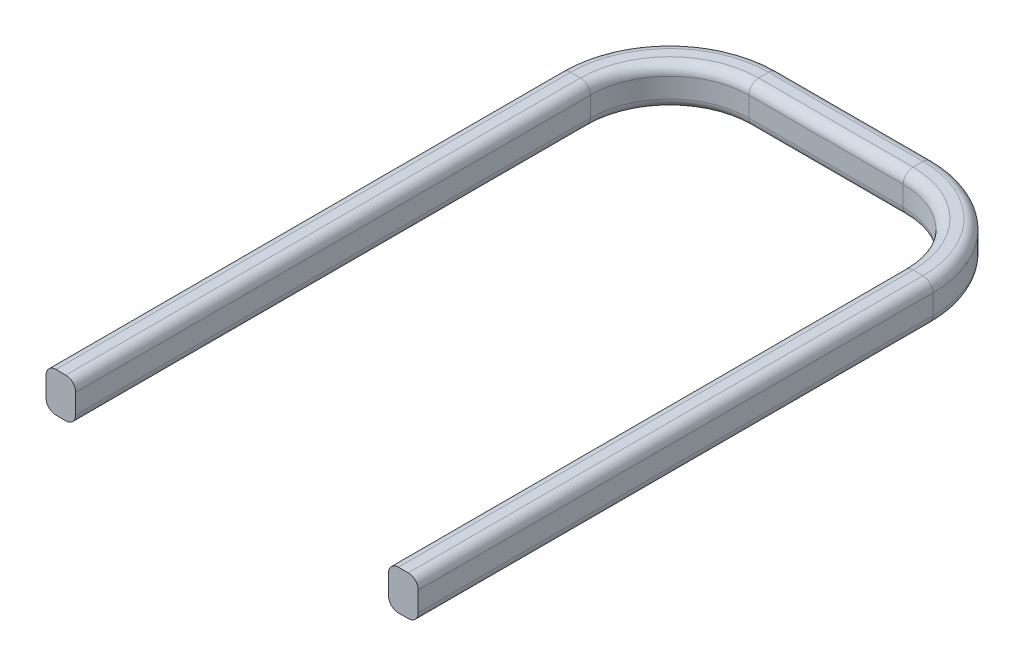
ISO-10303-21;
HEADER;
FILE_DESCRIPTION(('STEP AP214'),'2;1');
FILE_NAME('part.step','',(''),(''),'','','');
FILE_SCHEMA(('AUTOMOTIVE_DESIGN { 1 0 10303 214 1 1 1 1 }'));
ENDSEC;
DATA;
#1=APPLICATION_CONTEXT('core data for automotive mechanical design processes');
#2=APPLICATION_PROTOCOL_DEFINITION('international standard','automotive_design',2000,#1);
#3=PRODUCT_CONTEXT('',#1,'mechanical');
#4=PRODUCT('Part','Part','',(#3));
#5=PRODUCT_RELATED_PRODUCT_CATEGORY('part','',(#4));
#6=PRODUCT_DEFINITION_FORMATION('','',#4);
#7=PRODUCT_DEFINITION_CONTEXT('part definition',#1,'design');
#8=PRODUCT_DEFINITION('design','',#6,#7);
#9=PRODUCT_DEFINITION_SHAPE('','',#8);
#10=(LENGTH_UNIT() NAMED_UNIT(*) SI_UNIT(.MILLI.,.METRE.));
#11=(NAMED_UNIT(*) PLANE_ANGLE_UNIT() SI_UNIT($,.RADIAN.));
#12=(NAMED_UNIT(*) SI_UNIT($,.STERADIAN.) SOLID_ANGLE_UNIT());
#13=UNCERTAINTY_MEASURE_WITH_UNIT(LENGTH_MEASURE(1.E-05),#10,'distance_accuracy_value','');
#14=(GEOMETRIC_REPRESENTATION_CONTEXT(3) GLOBAL_UNCERTAINTY_ASSIGNED_CONTEXT((#13)) GLOBAL_UNIT_ASSIGNED_CONTEXT((#10,
#11,#12)) REPRESENTATION_CONTEXT('',''));
#15=CARTESIAN_POINT('',(0.,0.,0.));
#16=DIRECTION('',(0.,0.,1.));
#17=DIRECTION('',(1.,0.,0.));
#18=AXIS2_PLACEMENT_3D('',#15,#16,#17);
#19=CARTESIAN_POINT('',(0.,0.,0.));
#20=DIRECTION('',(0.,0.,1.));
#21=DIRECTION('',(1.,0.,0.));
#22=AXIS2_PLACEMENT_3D('',#19,#20,#21);
#23=PLANE('',#22);
#24=DIRECTION('',(0.,-1.,0.));
#25=VECTOR('',#24,1.);
#26=CARTESIAN_POINT('',(-4.7,0.,0.));
#27=LINE('',#26,#25);
#28=CARTESIAN_POINT('',(-4.7,0.75,0.));
#29=VERTEX_POINT('',#28);
#30=CARTESIAN_POINT('',(-4.7,0.25,0.));
#31=VERTEX_POINT('',#30);
#32=EDGE_CURVE('E457',#29,#31,#27,.T.);
#33=ORIENTED_EDGE('',*,*,#32,.T.);
#34=CARTESIAN_POINT('',(-4.45,0.25,0.));
#35=DIRECTION('',(0.,0.,1.));
#36=DIRECTION('',(1.,0.,0.));
#37=AXIS2_PLACEMENT_3D('',#34,#35,#36);
#38=CIRCLE('',#37,0.25);
#39=CARTESIAN_POINT('',(-4.45,0.,0.));
#40=VERTEX_POINT('',#39);
#41=EDGE_CURVE('E355',#31,#40,#38,.T.);
#42=ORIENTED_EDGE('',*,*,#41,.T.);
#43=DIRECTION('',(1.,0.,0.));
#44=VECTOR('',#43,1.);
#45=CARTESIAN_POINT('',(-3.95,0.,0.));
#46=LINE('',#45,#44);
#47=CARTESIAN_POINT('',(-4.2,0.,0.));
#48=VERTEX_POINT('',#47);
#49=EDGE_CURVE('E232',#40,#48,#46,.T.);
#50=ORIENTED_EDGE('',*,*,#49,.T.);
#51=CARTESIAN_POINT('',(-4.2,0.25,0.));
#52=DIRECTION('',(0.,0.,1.));
#53=DIRECTION('',(1.,0.,0.));
#54=AXIS2_PLACEMENT_3D('',#51,#52,#53);
#55=CIRCLE('',#54,0.25);
#56=CARTESIAN_POINT('',(-3.95,0.25,0.));
#57=VERTEX_POINT('',#56);
#58=EDGE_CURVE('E352',#48,#57,#55,.T.);
#59=ORIENTED_EDGE('',*,*,#58,.T.);
#60=DIRECTION('',(0.,1.,0.));
#61=VECTOR('',#60,1.);
#62=CARTESIAN_POINT('',(-3.95,0.,0.));
#63=LINE('',#62,#61);
#64=CARTESIAN_POINT('',(-3.95,0.75,0.));
#65=VERTEX_POINT('',#64);
#66=EDGE_CURVE('E213',#57,#65,#63,.T.);
#67=ORIENTED_EDGE('',*,*,#66,.T.);
#68=CARTESIAN_POINT('',(-4.2,0.75,0.));
#69=DIRECTION('',(0.,0.,1.));
#70=DIRECTION('',(1.,0.,0.));
#71=AXIS2_PLACEMENT_3D('',#68,#69,#70);
#72=CIRCLE('',#71,0.25);
#73=CARTESIAN_POINT('',(-4.2,1.,0.));
#74=VERTEX_POINT('',#73);
#75=EDGE_CURVE('E346',#65,#74,#72,.T.);
#76=ORIENTED_EDGE('',*,*,#75,.T.);
#77=DIRECTION('',(-1.,0.,0.));
#78=VECTOR('',#77,1.);
#79=CARTESIAN_POINT('',(-3.95,1.,0.));
#80=LINE('',#79,#78);
#81=CARTESIAN_POINT('',(-4.45,1.,0.));
#82=VERTEX_POINT('',#81);
#83=EDGE_CURVE('E454',#74,#82,#80,.T.);
#84=ORIENTED_EDGE('',*,*,#83,.T.);
#85=CARTESIAN_POINT('',(-4.45,0.75,0.));
#86=DIRECTION('',(0.,0.,1.));
#87=DIRECTION('',(1.,0.,0.));
#88=AXIS2_PLACEMENT_3D('',#85,#86,#87);
#89=CIRCLE('',#88,0.25);
#90=EDGE_CURVE('E349',#82,#29,#89,.T.);
#91=ORIENTED_EDGE('',*,*,#90,.T.);
#92=EDGE_LOOP('',(#33,#42,#50,#59,#67,#76,#84,#91));
#93=FACE_BOUND('',#92,.T.);
#94=ADVANCED_FACE('F42',(#93),#23,.T.);
#95=CARTESIAN_POINT('',(0.,0.,0.));
#96=DIRECTION('',(0.,0.,-1.));
#97=DIRECTION('',(-1.,0.,0.));
#98=AXIS2_PLACEMENT_3D('',#95,#96,#97);
#99=PLANE('',#98);
#100=DIRECTION('',(0.,1.,0.));
#101=VECTOR('',#100,1.);
#102=CARTESIAN_POINT('',(3.95,0.,0.));
#103=LINE('',#102,#101);
#104=CARTESIAN_POINT('',(3.95,0.25,0.));
#105=VERTEX_POINT('',#104);
#106=CARTESIAN_POINT('',(3.95,0.75,0.));
#107=VERTEX_POINT('',#106);
#108=EDGE_CURVE('E477',#105,#107,#103,.T.);
#109=ORIENTED_EDGE('',*,*,#108,.F.);
#110=CARTESIAN_POINT('',(4.2,0.25,0.));
#111=DIRECTION('',(0.,0.,-1.));
#112=DIRECTION('',(-1.,0.,0.));
#113=AXIS2_PLACEMENT_3D('',#110,#111,#112);
#114=CIRCLE('',#113,0.25);
#115=CARTESIAN_POINT('',(4.2,0.,0.));
#116=VERTEX_POINT('',#115);
#117=EDGE_CURVE('E300',#105,#116,#114,.F.);
#118=ORIENTED_EDGE('',*,*,#117,.T.);
#119=DIRECTION('',(-1.,0.,0.));
#120=VECTOR('',#119,1.);
#121=CARTESIAN_POINT('',(3.95,0.,0.));
#122=LINE('',#121,#120);
#123=CARTESIAN_POINT('',(4.45,0.,0.));
#124=VERTEX_POINT('',#123);
#125=EDGE_CURVE('E255',#124,#116,#122,.T.);
#126=ORIENTED_EDGE('',*,*,#125,.F.);
#127=CARTESIAN_POINT('',(4.45,0.25,0.));
#128=DIRECTION('',(0.,0.,-1.));
#129=DIRECTION('',(-1.,0.,0.));
#130=AXIS2_PLACEMENT_3D('',#127,#128,#129);
#131=CIRCLE('',#130,0.25);
#132=CARTESIAN_POINT('',(4.7,0.25,0.));
#133=VERTEX_POINT('',#132);
#134=EDGE_CURVE('E297',#124,#133,#131,.F.);
#135=ORIENTED_EDGE('',*,*,#134,.T.);
#136=DIRECTION('',(0.,-1.,0.));
#137=VECTOR('',#136,1.);
#138=CARTESIAN_POINT('',(4.7,0.,0.));
#139=LINE('',#138,#137);
#140=CARTESIAN_POINT('',(4.7,0.75,0.));
#141=VERTEX_POINT('',#140);
#142=EDGE_CURVE('E500',#141,#133,#139,.T.);
#143=ORIENTED_EDGE('',*,*,#142,.F.);
#144=CARTESIAN_POINT('',(4.45,0.75,0.));
#145=DIRECTION('',(0.,0.,-1.));
#146=DIRECTION('',(-1.,0.,0.));
#147=AXIS2_PLACEMENT_3D('',#144,#145,#146);
#148=CIRCLE('',#147,0.25);
#149=CARTESIAN_POINT('',(4.45,1.,0.));
#150=VERTEX_POINT('',#149);
#151=EDGE_CURVE('E294',#141,#150,#148,.F.);
#152=ORIENTED_EDGE('',*,*,#151,.T.);
#153=DIRECTION('',(1.,0.,0.));
#154=VECTOR('',#153,1.);
#155=CARTESIAN_POINT('',(3.95,1.,0.));
#156=LINE('',#155,#154);
#157=CARTESIAN_POINT('',(4.2,1.,0.));
#158=VERTEX_POINT('',#157);
#159=EDGE_CURVE('E480',#158,#150,#156,.T.);
#160=ORIENTED_EDGE('',*,*,#159,.F.);
#161=CARTESIAN_POINT('',(4.2,0.75,0.));
#162=DIRECTION('',(0.,0.,-1.));
#163=DIRECTION('',(-1.,0.,0.));
#164=AXIS2_PLACEMENT_3D('',#161,#162,#163);
#165=CIRCLE('',#164,0.25);
#166=EDGE_CURVE('E291',#158,#107,#165,.F.);
#167=ORIENTED_EDGE('',*,*,#166,.T.);
#168=EDGE_LOOP('',(#109,#118,#126,#135,#143,#152,#160,#167));
#169=FACE_BOUND('',#168,.T.);
#170=ADVANCED_FACE('F573',(#169),#99,.F.);
#171=CARTESIAN_POINT('',(-3.95,0.,0.));
#172=DIRECTION('',(-1.,0.,0.));
#173=DIRECTION('',(0.,0.,1.));
#174=AXIS2_PLACEMENT_3D('',#171,#172,#173);
#175=PLANE('',#174);
#176=ORIENTED_EDGE('',*,*,#66,.F.);
#177=DIRECTION('',(0.,0.,-1.));
#178=VECTOR('',#177,1.);
#179=CARTESIAN_POINT('',(-3.95,0.25,0.));
#180=LINE('',#179,#178);
#181=CARTESIAN_POINT('',(-3.95,0.25,-13.));
#182=VERTEX_POINT('',#181);
#183=EDGE_CURVE('E207',#57,#182,#180,.T.);
#184=ORIENTED_EDGE('',*,*,#183,.T.);
#185=DIRECTION('',(0.,1.,0.));
#186=VECTOR('',#185,1.);
#187=CARTESIAN_POINT('',(-3.95,0.,-13.));
#188=LINE('',#187,#186);
#189=CARTESIAN_POINT('',(-3.95,0.75,-13.));
#190=VERTEX_POINT('',#189);
#191=EDGE_CURVE('E210',#182,#190,#188,.T.);
#192=ORIENTED_EDGE('',*,*,#191,.T.);
#193=DIRECTION('',(0.,0.,-1.));
#194=VECTOR('',#193,1.);
#195=CARTESIAN_POINT('',(-3.95,0.75,0.));
#196=LINE('',#195,#194);
#197=EDGE_CURVE('E219',#190,#65,#196,.F.);
#198=ORIENTED_EDGE('',*,*,#197,.T.);
#199=EDGE_LOOP('',(#176,#184,#192,#198));
#200=FACE_BOUND('',#199,.T.);
#201=ADVANCED_FACE('F209',(#200),#175,.F.);
#202=CARTESIAN_POINT('',(-3.95,1.,0.));
#203=DIRECTION('',(0.,-1.,0.));
#204=DIRECTION('',(1.,0.,0.));
#205=AXIS2_PLACEMENT_3D('',#202,#203,#204);
#206=PLANE('',#205);
#207=DIRECTION('',(-1.,0.,0.));
#208=VECTOR('',#207,1.);
#209=CARTESIAN_POINT('',(-3.95,1.,-13.));
#210=LINE('',#209,#208);
#211=CARTESIAN_POINT('',(-4.2,1.,-13.));
#212=VERTEX_POINT('',#211);
#213=CARTESIAN_POINT('',(-4.45,1.,-13.));
#214=VERTEX_POINT('',#213);
#215=EDGE_CURVE('E231',#212,#214,#210,.T.);
#216=ORIENTED_EDGE('',*,*,#215,.T.);
#217=DIRECTION('',(0.,0.,-1.));
#218=VECTOR('',#217,1.);
#219=CARTESIAN_POINT('',(-4.45,1.,0.));
#220=LINE('',#219,#218);
#221=EDGE_CURVE('E362',#214,#82,#220,.F.);
#222=ORIENTED_EDGE('',*,*,#221,.T.);
#223=ORIENTED_EDGE('',*,*,#83,.F.);
#224=DIRECTION('',(0.,0.,-1.));
#225=VECTOR('',#224,1.);
#226=CARTESIAN_POINT('',(-4.2,1.,0.));
#227=LINE('',#226,#225);
#228=EDGE_CURVE('E218',#74,#212,#227,.T.);
#229=ORIENTED_EDGE('',*,*,#228,.T.);
#230=EDGE_LOOP('',(#216,#222,#223,#229));
#231=FACE_BOUND('',#230,.T.);
#232=ADVANCED_FACE('F906',(#231),#206,.F.);
#233=CARTESIAN_POINT('',(-4.7,0.,0.));
#234=DIRECTION('',(1.,0.,0.));
#235=DIRECTION('',(0.,0.,-1.));
#236=AXIS2_PLACEMENT_3D('',#233,#234,#235);
#237=PLANE('',#236);
#238=DIRECTION('',(0.,-1.,0.));
#239=VECTOR('',#238,1.);
#240=CARTESIAN_POINT('',(-4.7,0.,-13.));
#241=LINE('',#240,#239);
#242=CARTESIAN_POINT('',(-4.7,0.75,-13.));
#243=VERTEX_POINT('',#242);
#244=CARTESIAN_POINT('',(-4.7,0.25,-13.));
#245=VERTEX_POINT('',#244);
#246=EDGE_CURVE('E486',#243,#245,#241,.T.);
#247=ORIENTED_EDGE('',*,*,#246,.T.);
#248=DIRECTION('',(0.,0.,-1.));
#249=VECTOR('',#248,1.);
#250=CARTESIAN_POINT('',(-4.7,0.25,0.));
#251=LINE('',#250,#249);
#252=EDGE_CURVE('E343',#245,#31,#251,.F.);
#253=ORIENTED_EDGE('',*,*,#252,.T.);
#254=ORIENTED_EDGE('',*,*,#32,.F.);
#255=DIRECTION('',(0.,0.,-1.));
#256=VECTOR('',#255,1.);
#257=CARTESIAN_POINT('',(-4.7,0.75,0.));
#258=LINE('',#257,#256);
#259=EDGE_CURVE('E339',#29,#243,#258,.T.);
#260=ORIENTED_EDGE('',*,*,#259,.T.);
#261=EDGE_LOOP('',(#247,#253,#254,#260));
#262=FACE_BOUND('',#261,.T.);
#263=ADVANCED_FACE('F895',(#262),#237,.F.);
#264=CARTESIAN_POINT('',(-3.95,0.,0.));
#265=DIRECTION('',(0.,1.,0.));
#266=DIRECTION('',(-1.,0.,0.));
#267=AXIS2_PLACEMENT_3D('',#264,#265,#266);
#268=PLANE('',#267);
#269=ORIENTED_EDGE('',*,*,#49,.F.);
#270=DIRECTION('',(0.,0.,-1.));
#271=VECTOR('',#270,1.);
#272=CARTESIAN_POINT('',(-4.45,0.,0.));
#273=LINE('',#272,#271);
#274=CARTESIAN_POINT('',(-4.45,0.,-13.));
#275=VERTEX_POINT('',#274);
#276=EDGE_CURVE('E336',#40,#275,#273,.T.);
#277=ORIENTED_EDGE('',*,*,#276,.T.);
#278=DIRECTION('',(1.,0.,0.));
#279=VECTOR('',#278,1.);
#280=CARTESIAN_POINT('',(-3.95,0.,-13.));
#281=LINE('',#280,#279);
#282=CARTESIAN_POINT('',(-4.2,0.,-13.));
#283=VERTEX_POINT('',#282);
#284=EDGE_CURVE('E464',#275,#283,#281,.T.);
#285=ORIENTED_EDGE('',*,*,#284,.T.);
#286=DIRECTION('',(0.,0.,-1.));
#287=VECTOR('',#286,1.);
#288=CARTESIAN_POINT('',(-4.2,0.,0.));
#289=LINE('',#288,#287);
#290=EDGE_CURVE('E238',#283,#48,#289,.F.);
#291=ORIENTED_EDGE('',*,*,#290,.T.);
#292=EDGE_LOOP('',(#269,#277,#285,#291));
#293=FACE_BOUND('',#292,.T.);
#294=ADVANCED_FACE('F886',(#293),#268,.F.);
#295=CARTESIAN_POINT('',(-1.95,0.,-13.));
#296=DIRECTION('',(0.,-1.,0.));
#297=DIRECTION('',(0.,0.,-1.));
#298=AXIS2_PLACEMENT_3D('',#295,#296,#297);
#299=CYLINDRICAL_SURFACE('',#298,2.);
#300=ORIENTED_EDGE('',*,*,#191,.F.);
#301=CARTESIAN_POINT('',(-1.95,0.25,-13.));
#302=DIRECTION('',(0.,1.,0.));
#303=DIRECTION('',(0.,0.,1.));
#304=AXIS2_PLACEMENT_3D('',#301,#302,#303);
#305=CIRCLE('',#304,2.);
#306=CARTESIAN_POINT('',(-1.95,0.25,-15.));
#307=VERTEX_POINT('',#306);
#308=EDGE_CURVE('E226',#182,#307,#305,.F.);
#309=ORIENTED_EDGE('',*,*,#308,.T.);
#310=DIRECTION('',(0.,1.,0.));
#311=VECTOR('',#310,1.);
#312=CARTESIAN_POINT('',(-1.95,0.,-15.));
#313=LINE('',#312,#311);
#314=CARTESIAN_POINT('',(-1.95,0.75,-15.));
#315=VERTEX_POINT('',#314);
#316=EDGE_CURVE('E460',#307,#315,#313,.T.);
#317=ORIENTED_EDGE('',*,*,#316,.T.);
#318=CARTESIAN_POINT('',(-1.95,0.75,-13.));
#319=DIRECTION('',(0.,-1.,0.));
#320=DIRECTION('',(0.,0.,-1.));
#321=AXIS2_PLACEMENT_3D('',#318,#319,#320);
#322=CIRCLE('',#321,2.);
#323=EDGE_CURVE('E229',#315,#190,#322,.F.);
#324=ORIENTED_EDGE('',*,*,#323,.T.);
#325=EDGE_LOOP('',(#300,#309,#317,#324));
#326=FACE_BOUND('',#325,.T.);
#327=ADVANCED_FACE('F223',(#326),#299,.F.);
#328=CARTESIAN_POINT('',(-3.95,1.,-13.));
#329=DIRECTION('',(0.,-1.,0.));
#330=DIRECTION('',(0.,0.,-1.));
#331=AXIS2_PLACEMENT_3D('',#328,#329,#330);
#332=PLANE('',#331);
#333=DIRECTION('',(0.,0.,-1.));
#334=VECTOR('',#333,1.);
#335=CARTESIAN_POINT('',(-1.95,1.,-15.));
#336=LINE('',#335,#334);
#337=CARTESIAN_POINT('',(-1.95,1.,-15.25));
#338=VERTEX_POINT('',#337);
#339=CARTESIAN_POINT('',(-1.95,1.,-15.5));
#340=VERTEX_POINT('',#339);
#341=EDGE_CURVE('E463',#338,#340,#336,.T.);
#342=ORIENTED_EDGE('',*,*,#341,.T.);
#343=CARTESIAN_POINT('',(-1.95,1.,-13.));
#344=DIRECTION('',(0.,-1.,0.));
#345=DIRECTION('',(0.,0.,-1.));
#346=AXIS2_PLACEMENT_3D('',#343,#344,#345);
#347=CIRCLE('',#346,2.5);
#348=EDGE_CURVE('E368',#340,#214,#347,.F.);
#349=ORIENTED_EDGE('',*,*,#348,.T.);
#350=ORIENTED_EDGE('',*,*,#215,.F.);
#351=CARTESIAN_POINT('',(-1.95,1.,-13.));
#352=DIRECTION('',(0.,-1.,0.));
#353=DIRECTION('',(0.,0.,-1.));
#354=AXIS2_PLACEMENT_3D('',#351,#352,#353);
#355=CIRCLE('',#354,2.25);
#356=EDGE_CURVE('E365',#212,#338,#355,.T.);
#357=ORIENTED_EDGE('',*,*,#356,.T.);
#358=EDGE_LOOP('',(#342,#349,#350,#357));
#359=FACE_BOUND('',#358,.T.);
#360=ADVANCED_FACE('F865',(#359),#332,.F.);
#361=CARTESIAN_POINT('',(-1.95,0.,-13.));
#362=DIRECTION('',(0.,-1.,0.));
#363=DIRECTION('',(0.,0.,-1.));
#364=AXIS2_PLACEMENT_3D('',#361,#362,#363);
#365=CYLINDRICAL_SURFACE('',#364,2.75);
#366=DIRECTION('',(0.,-1.,0.));
#367=VECTOR('',#366,1.);
#368=CARTESIAN_POINT('',(-1.95,0.,-15.75));
#369=LINE('',#368,#367);
#370=CARTESIAN_POINT('',(-1.95,0.75,-15.75));
#371=VERTEX_POINT('',#370);
#372=CARTESIAN_POINT('',(-1.95,0.25,-15.75));
#373=VERTEX_POINT('',#372);
#374=EDGE_CURVE('E490',#371,#373,#369,.T.);
#375=ORIENTED_EDGE('',*,*,#374,.T.);
#376=CARTESIAN_POINT('',(-1.95,0.25,-13.));
#377=DIRECTION('',(0.,1.,0.));
#378=DIRECTION('',(0.,0.,1.));
#379=AXIS2_PLACEMENT_3D('',#376,#377,#378);
#380=CIRCLE('',#379,2.75);
#381=EDGE_CURVE('E331',#373,#245,#380,.T.);
#382=ORIENTED_EDGE('',*,*,#381,.T.);
#383=ORIENTED_EDGE('',*,*,#246,.F.);
#384=CARTESIAN_POINT('',(-1.95,0.75,-13.));
#385=DIRECTION('',(0.,-1.,0.));
#386=DIRECTION('',(0.,0.,-1.));
#387=AXIS2_PLACEMENT_3D('',#384,#385,#386);
#388=CIRCLE('',#387,2.75);
#389=EDGE_CURVE('E328',#243,#371,#388,.T.);
#390=ORIENTED_EDGE('',*,*,#389,.T.);
#391=EDGE_LOOP('',(#375,#382,#383,#390));
#392=FACE_BOUND('',#391,.T.);
#393=ADVANCED_FACE('F623',(#392),#365,.T.);
#394=CARTESIAN_POINT('',(-3.95,0.,-13.));
#395=DIRECTION('',(0.,1.,0.));
#396=DIRECTION('',(0.,0.,1.));
#397=AXIS2_PLACEMENT_3D('',#394,#395,#396);
#398=PLANE('',#397);
#399=DIRECTION('',(0.,0.,1.));
#400=VECTOR('',#399,1.);
#401=CARTESIAN_POINT('',(-1.95,0.,-15.));
#402=LINE('',#401,#400);
#403=CARTESIAN_POINT('',(-1.95,0.,-15.5));
#404=VERTEX_POINT('',#403);
#405=CARTESIAN_POINT('',(-1.95,0.,-15.25));
#406=VERTEX_POINT('',#405);
#407=EDGE_CURVE('E470',#404,#406,#402,.T.);
#408=ORIENTED_EDGE('',*,*,#407,.T.);
#409=CARTESIAN_POINT('',(-1.95,0.,-13.));
#410=DIRECTION('',(0.,1.,0.));
#411=DIRECTION('',(0.,0.,1.));
#412=AXIS2_PLACEMENT_3D('',#409,#410,#411);
#413=CIRCLE('',#412,2.25);
#414=EDGE_CURVE('E253',#406,#283,#413,.T.);
#415=ORIENTED_EDGE('',*,*,#414,.T.);
#416=ORIENTED_EDGE('',*,*,#284,.F.);
#417=CARTESIAN_POINT('',(-1.95,0.,-13.));
#418=DIRECTION('',(0.,1.,0.));
#419=DIRECTION('',(0.,0.,1.));
#420=AXIS2_PLACEMENT_3D('',#417,#418,#419);
#421=CIRCLE('',#420,2.5);
#422=EDGE_CURVE('E249',#275,#404,#421,.F.);
#423=ORIENTED_EDGE('',*,*,#422,.T.);
#424=EDGE_LOOP('',(#408,#415,#416,#423));
#425=FACE_BOUND('',#424,.T.);
#426=ADVANCED_FACE('F615',(#425),#398,.F.);
#427=CARTESIAN_POINT('',(-1.95,0.,-15.));
#428=DIRECTION('',(0.,0.,-1.));
#429=DIRECTION('',(-1.,0.,0.));
#430=AXIS2_PLACEMENT_3D('',#427,#428,#429);
#431=PLANE('',#430);
#432=ORIENTED_EDGE('',*,*,#316,.F.);
#433=DIRECTION('',(1.,0.,0.));
#434=VECTOR('',#433,1.);
#435=CARTESIAN_POINT('',(-1.95,0.25,-15.));
#436=LINE('',#435,#434);
#437=CARTESIAN_POINT('',(1.94999999999999,0.25,-15.));
#438=VERTEX_POINT('',#437);
#439=EDGE_CURVE('E264',#307,#438,#436,.T.);
#440=ORIENTED_EDGE('',*,*,#439,.T.);
#441=DIRECTION('',(0.,1.,0.));
#442=VECTOR('',#441,1.);
#443=CARTESIAN_POINT('',(1.94999999999999,0.,-15.));
#444=LINE('',#443,#442);
#445=CARTESIAN_POINT('',(1.94999999999999,0.75,-15.));
#446=VERTEX_POINT('',#445);
#447=EDGE_CURVE('E465',#438,#446,#444,.T.);
#448=ORIENTED_EDGE('',*,*,#447,.T.);
#449=DIRECTION('',(1.,0.,0.));
#450=VECTOR('',#449,1.);
#451=CARTESIAN_POINT('',(-1.95,0.75,-15.));
#452=LINE('',#451,#450);
#453=EDGE_CURVE('E261',#446,#315,#452,.F.);
#454=ORIENTED_EDGE('',*,*,#453,.T.);
#455=EDGE_LOOP('',(#432,#440,#448,#454));
#456=FACE_BOUND('',#455,.T.);
#457=ADVANCED_FACE('F613',(#456),#431,.F.);
#458=CARTESIAN_POINT('',(-1.95,1.,-15.));
#459=DIRECTION('',(0.,-1.,0.));
#460=DIRECTION('',(0.,0.,-1.));
#461=AXIS2_PLACEMENT_3D('',#458,#459,#460);
#462=PLANE('',#461);
#463=DIRECTION('',(0.,0.,-1.));
#464=VECTOR('',#463,1.);
#465=CARTESIAN_POINT('',(1.94999999999999,1.,-15.));
#466=LINE('',#465,#464);
#467=CARTESIAN_POINT('',(1.94999999999999,1.,-15.25));
#468=VERTEX_POINT('',#467);
#469=CARTESIAN_POINT('',(1.94999999999999,1.,-15.5));
#470=VERTEX_POINT('',#469);
#471=EDGE_CURVE('E469',#468,#470,#466,.T.);
#472=ORIENTED_EDGE('',*,*,#471,.T.);
#473=DIRECTION('',(1.,0.,0.));
#474=VECTOR('',#473,1.);
#475=CARTESIAN_POINT('',(-1.95,1.,-15.5));
#476=LINE('',#475,#474);
#477=EDGE_CURVE('E374',#470,#340,#476,.F.);
#478=ORIENTED_EDGE('',*,*,#477,.T.);
#479=ORIENTED_EDGE('',*,*,#341,.F.);
#480=DIRECTION('',(1.,0.,0.));
#481=VECTOR('',#480,1.);
#482=CARTESIAN_POINT('',(-1.95,1.,-15.25));
#483=LINE('',#482,#481);
#484=EDGE_CURVE('E371',#338,#468,#483,.T.);
#485=ORIENTED_EDGE('',*,*,#484,.T.);
#486=EDGE_LOOP('',(#472,#478,#479,#485));
#487=FACE_BOUND('',#486,.T.);
#488=ADVANCED_FACE('F591',(#487),#462,.F.);
#489=CARTESIAN_POINT('',(-1.95,0.,-15.75));
#490=DIRECTION('',(0.,0.,1.));
#491=DIRECTION('',(1.,0.,0.));
#492=AXIS2_PLACEMENT_3D('',#489,#490,#491);
#493=PLANE('',#492);
#494=DIRECTION('',(0.,-1.,0.));
#495=VECTOR('',#494,1.);
#496=CARTESIAN_POINT('',(1.94999999999999,0.,-15.75));
#497=LINE('',#496,#495);
#498=CARTESIAN_POINT('',(1.94999999999999,0.75,-15.75));
#499=VERTEX_POINT('',#498);
#500=CARTESIAN_POINT('',(1.94999999999999,0.25,-15.75));
#501=VERTEX_POINT('',#500);
#502=EDGE_CURVE('E494',#499,#501,#497,.T.);
#503=ORIENTED_EDGE('',*,*,#502,.T.);
#504=DIRECTION('',(1.,0.,0.));
#505=VECTOR('',#504,1.);
#506=CARTESIAN_POINT('',(-1.95,0.25,-15.75));
#507=LINE('',#506,#505);
#508=EDGE_CURVE('E325',#501,#373,#507,.F.);
#509=ORIENTED_EDGE('',*,*,#508,.T.);
#510=ORIENTED_EDGE('',*,*,#374,.F.);
#511=DIRECTION('',(1.,0.,0.));
#512=VECTOR('',#511,1.);
#513=CARTESIAN_POINT('',(-1.95,0.75,-15.75));
#514=LINE('',#513,#512);
#515=EDGE_CURVE('E322',#371,#499,#514,.T.);
#516=ORIENTED_EDGE('',*,*,#515,.T.);
#517=EDGE_LOOP('',(#503,#509,#510,#516));
#518=FACE_BOUND('',#517,.T.);
#519=ADVANCED_FACE('F621',(#518),#493,.F.);
#520=CARTESIAN_POINT('',(-1.95,0.,-15.));
#521=DIRECTION('',(0.,1.,0.));
#522=DIRECTION('',(0.,0.,1.));
#523=AXIS2_PLACEMENT_3D('',#520,#521,#522);
#524=PLANE('',#523);
#525=DIRECTION('',(0.,0.,1.));
#526=VECTOR('',#525,1.);
#527=CARTESIAN_POINT('',(1.94999999999999,0.,-15.));
#528=LINE('',#527,#526);
#529=CARTESIAN_POINT('',(1.94999999999999,0.,-15.5));
#530=VERTEX_POINT('',#529);
#531=CARTESIAN_POINT('',(1.94999999999999,0.,-15.25));
#532=VERTEX_POINT('',#531);
#533=EDGE_CURVE('E476',#530,#532,#528,.T.);
#534=ORIENTED_EDGE('',*,*,#533,.T.);
#535=DIRECTION('',(1.,0.,0.));
#536=VECTOR('',#535,1.);
#537=CARTESIAN_POINT('',(-1.95,0.,-15.25));
#538=LINE('',#537,#536);
#539=EDGE_CURVE('E270',#532,#406,#538,.F.);
#540=ORIENTED_EDGE('',*,*,#539,.T.);
#541=ORIENTED_EDGE('',*,*,#407,.F.);
#542=DIRECTION('',(1.,0.,0.));
#543=VECTOR('',#542,1.);
#544=CARTESIAN_POINT('',(-1.95,0.,-15.5));
#545=LINE('',#544,#543);
#546=EDGE_CURVE('E267',#404,#530,#545,.T.);
#547=ORIENTED_EDGE('',*,*,#546,.T.);
#548=EDGE_LOOP('',(#534,#540,#541,#547));
#549=FACE_BOUND('',#548,.T.);
#550=ADVANCED_FACE('F556',(#549),#524,.F.);
#551=CARTESIAN_POINT('',(1.95,0.,-13.));
#552=DIRECTION('',(0.,-1.,0.));
#553=DIRECTION('',(0.,0.,-1.));
#554=AXIS2_PLACEMENT_3D('',#551,#552,#553);
#555=CYLINDRICAL_SURFACE('',#554,2.);
#556=ORIENTED_EDGE('',*,*,#447,.F.);
#557=CARTESIAN_POINT('',(1.95,0.25,-13.));
#558=DIRECTION('',(0.,1.,0.));
#559=DIRECTION('',(0.,0.,1.));
#560=AXIS2_PLACEMENT_3D('',#557,#558,#559);
#561=CIRCLE('',#560,2.);
#562=CARTESIAN_POINT('',(3.95,0.25,-13.));
#563=VERTEX_POINT('',#562);
#564=EDGE_CURVE('E276',#438,#563,#561,.F.);
#565=ORIENTED_EDGE('',*,*,#564,.T.);
#566=DIRECTION('',(0.,1.,0.));
#567=VECTOR('',#566,1.);
#568=CARTESIAN_POINT('',(3.95,0.,-13.));
#569=LINE('',#568,#567);
#570=CARTESIAN_POINT('',(3.95,0.75,-13.));
#571=VERTEX_POINT('',#570);
#572=EDGE_CURVE('E471',#563,#571,#569,.T.);
#573=ORIENTED_EDGE('',*,*,#572,.T.);
#574=CARTESIAN_POINT('',(1.95,0.75,-13.));
#575=DIRECTION('',(0.,-1.,0.));
#576=DIRECTION('',(0.,0.,-1.));
#577=AXIS2_PLACEMENT_3D('',#574,#575,#576);
#578=CIRCLE('',#577,2.);
#579=EDGE_CURVE('E273',#571,#446,#578,.F.);
#580=ORIENTED_EDGE('',*,*,#579,.T.);
#581=EDGE_LOOP('',(#556,#565,#573,#580));
#582=FACE_BOUND('',#581,.T.);
#583=ADVANCED_FACE('F609',(#582),#555,.F.);
#584=CARTESIAN_POINT('',(1.94999999999999,1.,-15.));
#585=DIRECTION('',(0.,-1.,0.));
#586=DIRECTION('',(0.,0.,-1.));
#587=AXIS2_PLACEMENT_3D('',#584,#585,#586);
#588=PLANE('',#587);
#589=DIRECTION('',(1.,0.,0.));
#590=VECTOR('',#589,1.);
#591=CARTESIAN_POINT('',(3.95,1.,-13.));
#592=LINE('',#591,#590);
#593=CARTESIAN_POINT('',(4.2,1.,-13.));
#594=VERTEX_POINT('',#593);
#595=CARTESIAN_POINT('',(4.45,1.,-13.));
#596=VERTEX_POINT('',#595);
#597=EDGE_CURVE('E475',#594,#596,#592,.T.);
#598=ORIENTED_EDGE('',*,*,#597,.T.);
#599=CARTESIAN_POINT('',(1.95,1.,-13.));
#600=DIRECTION('',(0.,-1.,0.));
#601=DIRECTION('',(0.,0.,-1.));
#602=AXIS2_PLACEMENT_3D('',#599,#600,#601);
#603=CIRCLE('',#602,2.5);
#604=EDGE_CURVE('E379',#596,#470,#603,.F.);
#605=ORIENTED_EDGE('',*,*,#604,.T.);
#606=ORIENTED_EDGE('',*,*,#471,.F.);
#607=CARTESIAN_POINT('',(1.95,1.,-13.));
#608=DIRECTION('',(0.,-1.,0.));
#609=DIRECTION('',(0.,0.,-1.));
#610=AXIS2_PLACEMENT_3D('',#607,#608,#609);
#611=CIRCLE('',#610,2.25);
#612=EDGE_CURVE('E65',#468,#594,#611,.T.);
#613=ORIENTED_EDGE('',*,*,#612,.T.);
#614=EDGE_LOOP('',(#598,#605,#606,#613));
#615=FACE_BOUND('',#614,.T.);
#616=ADVANCED_FACE('F588',(#615),#588,.F.);
#617=CARTESIAN_POINT('',(1.95,0.,-13.));
#618=DIRECTION('',(0.,-1.,0.));
#619=DIRECTION('',(0.,0.,-1.));
#620=AXIS2_PLACEMENT_3D('',#617,#618,#619);
#621=CYLINDRICAL_SURFACE('',#620,2.75);
#622=DIRECTION('',(0.,-1.,0.));
#623=VECTOR('',#622,1.);
#624=CARTESIAN_POINT('',(4.7,0.,-13.));
#625=LINE('',#624,#623);
#626=CARTESIAN_POINT('',(4.7,0.75,-13.));
#627=VERTEX_POINT('',#626);
#628=CARTESIAN_POINT('',(4.7,0.25,-13.));
#629=VERTEX_POINT('',#628);
#630=EDGE_CURVE('E497',#627,#629,#625,.T.);
#631=ORIENTED_EDGE('',*,*,#630,.T.);
#632=CARTESIAN_POINT('',(1.95,0.25,-13.));
#633=DIRECTION('',(0.,1.,0.));
#634=DIRECTION('',(0.,0.,1.));
#635=AXIS2_PLACEMENT_3D('',#632,#633,#634);
#636=CIRCLE('',#635,2.75);
#637=EDGE_CURVE('E319',#629,#501,#636,.T.);
#638=ORIENTED_EDGE('',*,*,#637,.T.);
#639=ORIENTED_EDGE('',*,*,#502,.F.);
#640=CARTESIAN_POINT('',(1.95,0.75,-13.));
#641=DIRECTION('',(0.,-1.,0.));
#642=DIRECTION('',(0.,0.,-1.));
#643=AXIS2_PLACEMENT_3D('',#640,#641,#642);
#644=CIRCLE('',#643,2.75);
#645=EDGE_CURVE('E316',#499,#627,#644,.T.);
#646=ORIENTED_EDGE('',*,*,#645,.T.);
#647=EDGE_LOOP('',(#631,#638,#639,#646));
#648=FACE_BOUND('',#647,.T.);
#649=ADVANCED_FACE('F792',(#648),#621,.T.);
#650=CARTESIAN_POINT('',(1.94999999999999,0.,-15.));
#651=DIRECTION('',(0.,1.,0.));
#652=DIRECTION('',(0.,0.,1.));
#653=AXIS2_PLACEMENT_3D('',#650,#651,#652);
#654=PLANE('',#653);
#655=DIRECTION('',(-1.,0.,0.));
#656=VECTOR('',#655,1.);
#657=CARTESIAN_POINT('',(3.95,0.,-13.));
#658=LINE('',#657,#656);
#659=CARTESIAN_POINT('',(4.45,0.,-13.));
#660=VERTEX_POINT('',#659);
#661=CARTESIAN_POINT('',(4.2,0.,-13.));
#662=VERTEX_POINT('',#661);
#663=EDGE_CURVE('E481',#660,#662,#658,.T.);
#664=ORIENTED_EDGE('',*,*,#663,.T.);
#665=CARTESIAN_POINT('',(1.95,0.,-13.));
#666=DIRECTION('',(0.,1.,0.));
#667=DIRECTION('',(0.,0.,1.));
#668=AXIS2_PLACEMENT_3D('',#665,#666,#667);
#669=CIRCLE('',#668,2.25);
#670=EDGE_CURVE('E282',#662,#532,#669,.T.);
#671=ORIENTED_EDGE('',*,*,#670,.T.);
#672=ORIENTED_EDGE('',*,*,#533,.F.);
#673=CARTESIAN_POINT('',(1.95,0.,-13.));
#674=DIRECTION('',(0.,1.,0.));
#675=DIRECTION('',(0.,0.,1.));
#676=AXIS2_PLACEMENT_3D('',#673,#674,#675);
#677=CIRCLE('',#676,2.5);
#678=EDGE_CURVE('E279',#530,#660,#677,.F.);
#679=ORIENTED_EDGE('',*,*,#678,.T.);
#680=EDGE_LOOP('',(#664,#671,#672,#679));
#681=FACE_BOUND('',#680,.T.);
#682=ADVANCED_FACE('F553',(#681),#654,.F.);
#683=CARTESIAN_POINT('',(3.95,0.,-13.));
#684=DIRECTION('',(1.,0.,0.));
#685=DIRECTION('',(0.,0.,-1.));
#686=AXIS2_PLACEMENT_3D('',#683,#684,#685);
#687=PLANE('',#686);
#688=ORIENTED_EDGE('',*,*,#572,.F.);
#689=DIRECTION('',(0.,0.,1.));
#690=VECTOR('',#689,1.);
#691=CARTESIAN_POINT('',(3.95,0.25,-13.));
#692=LINE('',#691,#690);
#693=EDGE_CURVE('E288',#563,#105,#692,.T.);
#694=ORIENTED_EDGE('',*,*,#693,.T.);
#695=ORIENTED_EDGE('',*,*,#108,.T.);
#696=DIRECTION('',(0.,0.,1.));
#697=VECTOR('',#696,1.);
#698=CARTESIAN_POINT('',(3.95,0.75,-13.));
#699=LINE('',#698,#697);
#700=EDGE_CURVE('E285',#107,#571,#699,.F.);
#701=ORIENTED_EDGE('',*,*,#700,.T.);
#702=EDGE_LOOP('',(#688,#694,#695,#701));
#703=FACE_BOUND('',#702,.T.);
#704=ADVANCED_FACE('F606',(#703),#687,.F.);
#705=CARTESIAN_POINT('',(3.95,1.,-13.));
#706=DIRECTION('',(0.,-1.,0.));
#707=DIRECTION('',(1.,0.,0.));
#708=AXIS2_PLACEMENT_3D('',#705,#706,#707);
#709=PLANE('',#708);
#710=ORIENTED_EDGE('',*,*,#159,.T.);
#711=DIRECTION('',(0.,0.,1.));
#712=VECTOR('',#711,1.);
#713=CARTESIAN_POINT('',(4.45,1.,-13.));
#714=LINE('',#713,#712);
#715=EDGE_CURVE('E11',#150,#596,#714,.F.);
#716=ORIENTED_EDGE('',*,*,#715,.T.);
#717=ORIENTED_EDGE('',*,*,#597,.F.);
#718=DIRECTION('',(0.,0.,1.));
#719=VECTOR('',#718,1.);
#720=CARTESIAN_POINT('',(4.2,1.,-13.));
#721=LINE('',#720,#719);
#722=EDGE_CURVE('E52',#594,#158,#721,.T.);
#723=ORIENTED_EDGE('',*,*,#722,.T.);
#724=EDGE_LOOP('',(#710,#716,#717,#723));
#725=FACE_BOUND('',#724,.T.);
#726=ADVANCED_FACE('F603',(#725),#709,.F.);
#727=CARTESIAN_POINT('',(4.7,0.,-13.));
#728=DIRECTION('',(-1.,0.,0.));
#729=DIRECTION('',(0.,0.,1.));
#730=AXIS2_PLACEMENT_3D('',#727,#728,#729);
#731=PLANE('',#730);
#732=ORIENTED_EDGE('',*,*,#142,.T.);
#733=DIRECTION('',(0.,0.,1.));
#734=VECTOR('',#733,1.);
#735=CARTESIAN_POINT('',(4.7,0.25,-13.));
#736=LINE('',#735,#734);
#737=EDGE_CURVE('E313',#133,#629,#736,.F.);
#738=ORIENTED_EDGE('',*,*,#737,.T.);
#739=ORIENTED_EDGE('',*,*,#630,.F.);
#740=DIRECTION('',(0.,0.,1.));
#741=VECTOR('',#740,1.);
#742=CARTESIAN_POINT('',(4.7,0.75,-13.));
#743=LINE('',#742,#741);
#744=EDGE_CURVE('E310',#627,#141,#743,.T.);
#745=ORIENTED_EDGE('',*,*,#744,.T.);
#746=EDGE_LOOP('',(#732,#738,#739,#745));
#747=FACE_BOUND('',#746,.T.);
#748=ADVANCED_FACE('F576',(#747),#731,.F.);
#749=CARTESIAN_POINT('',(3.95,0.,-13.));
#750=DIRECTION('',(0.,1.,0.));
#751=DIRECTION('',(-1.,0.,0.));
#752=AXIS2_PLACEMENT_3D('',#749,#750,#751);
#753=PLANE('',#752);
#754=ORIENTED_EDGE('',*,*,#125,.T.);
#755=DIRECTION('',(0.,0.,1.));
#756=VECTOR('',#755,1.);
#757=CARTESIAN_POINT('',(4.2,0.,-13.));
#758=LINE('',#757,#756);
#759=EDGE_CURVE('E307',#116,#662,#758,.F.);
#760=ORIENTED_EDGE('',*,*,#759,.T.);
#761=ORIENTED_EDGE('',*,*,#663,.F.);
#762=DIRECTION('',(0.,0.,1.));
#763=VECTOR('',#762,1.);
#764=CARTESIAN_POINT('',(4.45,0.,-13.));
#765=LINE('',#764,#763);
#766=EDGE_CURVE('E303',#660,#124,#765,.T.);
#767=ORIENTED_EDGE('',*,*,#766,.T.);
#768=EDGE_LOOP('',(#754,#760,#761,#767));
#769=FACE_BOUND('',#768,.T.);
#770=ADVANCED_FACE('F536',(#769),#753,.F.);
#771=CARTESIAN_POINT('',(4.2,0.25,-13.));
#772=DIRECTION('',(0.,0.,1.));
#773=DIRECTION('',(1.,0.,0.));
#774=AXIS2_PLACEMENT_3D('',#771,#772,#773);
#775=CYLINDRICAL_SURFACE('',#774,0.25);
#776=ORIENTED_EDGE('',*,*,#117,.F.);
#777=ORIENTED_EDGE('',*,*,#693,.F.);
#778=CARTESIAN_POINT('',(4.2,0.25,-13.));
#779=DIRECTION('',(0.,0.,-1.));
#780=DIRECTION('',(-1.,0.,0.));
#781=AXIS2_PLACEMENT_3D('',#778,#779,#780);
#782=CIRCLE('',#781,0.25);
#783=EDGE_CURVE('E391',#662,#563,#782,.T.);
#784=ORIENTED_EDGE('',*,*,#783,.F.);
#785=ORIENTED_EDGE('',*,*,#759,.F.);
#786=EDGE_LOOP('',(#776,#777,#784,#785));
#787=FACE_BOUND('',#786,.T.);
#788=ADVANCED_FACE('F543',(#787),#775,.T.);
#789=CARTESIAN_POINT('',(1.95,0.25,-13.));
#790=DIRECTION('',(0.,1.,0.));
#791=DIRECTION('',(0.,0.,1.));
#792=AXIS2_PLACEMENT_3D('',#789,#790,#791);
#793=TOROIDAL_SURFACE('',#792,2.25,0.25);
#794=ORIENTED_EDGE('',*,*,#783,.T.);
#795=ORIENTED_EDGE('',*,*,#564,.F.);
#796=CARTESIAN_POINT('',(1.94999999999999,0.25,-15.25));
#797=DIRECTION('',(-1.,0.,0.));
#798=DIRECTION('',(0.,0.,1.));
#799=AXIS2_PLACEMENT_3D('',#796,#797,#798);
#800=CIRCLE('',#799,0.25);
#801=EDGE_CURVE('E242',#532,#438,#800,.T.);
#802=ORIENTED_EDGE('',*,*,#801,.F.);
#803=ORIENTED_EDGE('',*,*,#670,.F.);
#804=EDGE_LOOP('',(#794,#795,#802,#803));
#805=FACE_BOUND('',#804,.T.);
#806=ADVANCED_FACE('F549',(#805),#793,.T.);
#807=CARTESIAN_POINT('',(-4.2,0.25,0.));
#808=DIRECTION('',(0.,0.,-1.));
#809=DIRECTION('',(-1.,0.,0.));
#810=AXIS2_PLACEMENT_3D('',#807,#808,#809);
#811=CYLINDRICAL_SURFACE('',#810,0.25);
#812=ORIENTED_EDGE('',*,*,#58,.F.);
#813=ORIENTED_EDGE('',*,*,#290,.F.);
#814=CARTESIAN_POINT('',(-4.2,0.25,-13.));
#815=DIRECTION('',(0.,0.,-1.));
#816=DIRECTION('',(-1.,0.,0.));
#817=AXIS2_PLACEMENT_3D('',#814,#815,#816);
#818=CIRCLE('',#817,0.25);
#819=EDGE_CURVE('E236',#182,#283,#818,.T.);
#820=ORIENTED_EDGE('',*,*,#819,.F.);
#821=ORIENTED_EDGE('',*,*,#183,.F.);
#822=EDGE_LOOP('',(#812,#813,#820,#821));
#823=FACE_BOUND('',#822,.T.);
#824=ADVANCED_FACE('F237',(#823),#811,.T.);
#825=CARTESIAN_POINT('',(-1.95,0.25,-15.25));
#826=DIRECTION('',(1.,0.,0.));
#827=DIRECTION('',(0.,0.,-1.));
#828=AXIS2_PLACEMENT_3D('',#825,#826,#827);
#829=CYLINDRICAL_SURFACE('',#828,0.25);
#830=ORIENTED_EDGE('',*,*,#801,.T.);
#831=ORIENTED_EDGE('',*,*,#439,.F.);
#832=CARTESIAN_POINT('',(-1.95,0.25,-15.25));
#833=DIRECTION('',(-1.,0.,0.));
#834=DIRECTION('',(0.,0.,1.));
#835=AXIS2_PLACEMENT_3D('',#832,#833,#834);
#836=CIRCLE('',#835,0.25);
#837=EDGE_CURVE('E243',#406,#307,#836,.T.);
#838=ORIENTED_EDGE('',*,*,#837,.F.);
#839=ORIENTED_EDGE('',*,*,#539,.F.);
#840=EDGE_LOOP('',(#830,#831,#838,#839));
#841=FACE_BOUND('',#840,.T.);
#842=ADVANCED_FACE('F611',(#841),#829,.T.);
#843=CARTESIAN_POINT('',(-1.95,0.25,-13.));
#844=DIRECTION('',(0.,1.,0.));
#845=DIRECTION('',(0.,0.,1.));
#846=AXIS2_PLACEMENT_3D('',#843,#844,#845);
#847=TOROIDAL_SURFACE('',#846,2.25,0.25);
#848=ORIENTED_EDGE('',*,*,#819,.T.);
#849=ORIENTED_EDGE('',*,*,#414,.F.);
#850=ORIENTED_EDGE('',*,*,#837,.T.);
#851=ORIENTED_EDGE('',*,*,#308,.F.);
#852=EDGE_LOOP('',(#848,#849,#850,#851));
#853=FACE_BOUND('',#852,.T.);
#854=ADVANCED_FACE('F245',(#853),#847,.T.);
#855=CARTESIAN_POINT('',(-4.45,0.25,0.));
#856=DIRECTION('',(0.,0.,-1.));
#857=DIRECTION('',(-1.,0.,0.));
#858=AXIS2_PLACEMENT_3D('',#855,#856,#857);
#859=CYLINDRICAL_SURFACE('',#858,0.25);
#860=ORIENTED_EDGE('',*,*,#41,.F.);
#861=ORIENTED_EDGE('',*,*,#252,.F.);
#862=CARTESIAN_POINT('',(-4.45,0.25,-13.));
#863=DIRECTION('',(0.,0.,-1.));
#864=DIRECTION('',(-1.,0.,0.));
#865=AXIS2_PLACEMENT_3D('',#862,#863,#864);
#866=CIRCLE('',#865,0.25);
#867=EDGE_CURVE('E386',#275,#245,#866,.T.);
#868=ORIENTED_EDGE('',*,*,#867,.F.);
#869=ORIENTED_EDGE('',*,*,#276,.F.);
#870=EDGE_LOOP('',(#860,#861,#868,#869));
#871=FACE_BOUND('',#870,.T.);
#872=ADVANCED_FACE('F645',(#871),#859,.T.);
#873=CARTESIAN_POINT('',(-1.95,0.25,-13.));
#874=DIRECTION('',(0.,1.,0.));
#875=DIRECTION('',(0.,0.,1.));
#876=AXIS2_PLACEMENT_3D('',#873,#874,#875);
#877=TOROIDAL_SURFACE('',#876,2.5,0.25);
#878=ORIENTED_EDGE('',*,*,#867,.T.);
#879=ORIENTED_EDGE('',*,*,#381,.F.);
#880=CARTESIAN_POINT('',(-1.95,0.25,-15.5));
#881=DIRECTION('',(1.,0.,0.));
#882=DIRECTION('',(0.,0.,-1.));
#883=AXIS2_PLACEMENT_3D('',#880,#881,#882);
#884=CIRCLE('',#883,0.25);
#885=EDGE_CURVE('E404',#404,#373,#884,.T.);
#886=ORIENTED_EDGE('',*,*,#885,.F.);
#887=ORIENTED_EDGE('',*,*,#422,.F.);
#888=EDGE_LOOP('',(#878,#879,#886,#887));
#889=FACE_BOUND('',#888,.T.);
#890=ADVANCED_FACE('F658',(#889),#877,.T.);
#891=CARTESIAN_POINT('',(-1.95,0.25,-15.5));
#892=DIRECTION('',(1.,0.,0.));
#893=DIRECTION('',(0.,0.,-1.));
#894=AXIS2_PLACEMENT_3D('',#891,#892,#893);
#895=CYLINDRICAL_SURFACE('',#894,0.25);
#896=ORIENTED_EDGE('',*,*,#885,.T.);
#897=ORIENTED_EDGE('',*,*,#508,.F.);
#898=CARTESIAN_POINT('',(1.94999999999999,0.25,-15.5));
#899=DIRECTION('',(1.,0.,0.));
#900=DIRECTION('',(0.,0.,-1.));
#901=AXIS2_PLACEMENT_3D('',#898,#899,#900);
#902=CIRCLE('',#901,0.25);
#903=EDGE_CURVE('E399',#530,#501,#902,.T.);
#904=ORIENTED_EDGE('',*,*,#903,.F.);
#905=ORIENTED_EDGE('',*,*,#546,.F.);
#906=EDGE_LOOP('',(#896,#897,#904,#905));
#907=FACE_BOUND('',#906,.T.);
#908=ADVANCED_FACE('F561',(#907),#895,.T.);
#909=CARTESIAN_POINT('',(1.95,0.25,-13.));
#910=DIRECTION('',(0.,1.,0.));
#911=DIRECTION('',(0.,0.,1.));
#912=AXIS2_PLACEMENT_3D('',#909,#910,#911);
#913=TOROIDAL_SURFACE('',#912,2.5,0.25);
#914=ORIENTED_EDGE('',*,*,#903,.T.);
#915=ORIENTED_EDGE('',*,*,#637,.F.);
#916=CARTESIAN_POINT('',(4.45,0.25,-13.));
#917=DIRECTION('',(0.,0.,1.));
#918=DIRECTION('',(1.,0.,0.));
#919=AXIS2_PLACEMENT_3D('',#916,#917,#918);
#920=CIRCLE('',#919,0.25);
#921=EDGE_CURVE('E395',#660,#629,#920,.T.);
#922=ORIENTED_EDGE('',*,*,#921,.F.);
#923=ORIENTED_EDGE('',*,*,#678,.F.);
#924=EDGE_LOOP('',(#914,#915,#922,#923));
#925=FACE_BOUND('',#924,.T.);
#926=ADVANCED_FACE('F567',(#925),#913,.T.);
#927=CARTESIAN_POINT('',(4.45,0.25,-13.));
#928=DIRECTION('',(0.,0.,1.));
#929=DIRECTION('',(1.,0.,0.));
#930=AXIS2_PLACEMENT_3D('',#927,#928,#929);
#931=CYLINDRICAL_SURFACE('',#930,0.25);
#932=ORIENTED_EDGE('',*,*,#921,.T.);
#933=ORIENTED_EDGE('',*,*,#737,.F.);
#934=ORIENTED_EDGE('',*,*,#134,.F.);
#935=ORIENTED_EDGE('',*,*,#766,.F.);
#936=EDGE_LOOP('',(#932,#933,#934,#935));
#937=FACE_BOUND('',#936,.T.);
#938=ADVANCED_FACE('F570',(#937),#931,.T.);
#939=CARTESIAN_POINT('',(4.45,0.75,-13.));
#940=DIRECTION('',(0.,0.,1.));
#941=DIRECTION('',(1.,0.,0.));
#942=AXIS2_PLACEMENT_3D('',#939,#940,#941);
#943=CYLINDRICAL_SURFACE('',#942,0.25);
#944=ORIENTED_EDGE('',*,*,#151,.F.);
#945=ORIENTED_EDGE('',*,*,#744,.F.);
#946=CARTESIAN_POINT('',(4.45,0.75,-13.));
#947=DIRECTION('',(0.,0.,-1.));
#948=DIRECTION('',(-1.,0.,0.));
#949=AXIS2_PLACEMENT_3D('',#946,#947,#948);
#950=CIRCLE('',#949,0.25);
#951=EDGE_CURVE('E400',#596,#627,#950,.T.);
#952=ORIENTED_EDGE('',*,*,#951,.F.);
#953=ORIENTED_EDGE('',*,*,#715,.F.);
#954=EDGE_LOOP('',(#944,#945,#952,#953));
#955=FACE_BOUND('',#954,.T.);
#956=ADVANCED_FACE('F581',(#955),#943,.T.);
#957=CARTESIAN_POINT('',(1.95,0.75,-13.));
#958=DIRECTION('',(0.,-1.,0.));
#959=DIRECTION('',(0.,0.,-1.));
#960=AXIS2_PLACEMENT_3D('',#957,#958,#959);
#961=TOROIDAL_SURFACE('',#960,2.5,0.25);
#962=ORIENTED_EDGE('',*,*,#951,.T.);
#963=ORIENTED_EDGE('',*,*,#645,.F.);
#964=CARTESIAN_POINT('',(1.94999999999999,0.75,-15.5));
#965=DIRECTION('',(-1.,0.,0.));
#966=DIRECTION('',(0.,0.,1.));
#967=AXIS2_PLACEMENT_3D('',#964,#965,#966);
#968=CIRCLE('',#967,0.25);
#969=EDGE_CURVE('E418',#470,#499,#968,.T.);
#970=ORIENTED_EDGE('',*,*,#969,.F.);
#971=ORIENTED_EDGE('',*,*,#604,.F.);
#972=EDGE_LOOP('',(#962,#963,#970,#971));
#973=FACE_BOUND('',#972,.T.);
#974=ADVANCED_FACE('F585',(#973),#961,.T.);
#975=CARTESIAN_POINT('',(-1.95,0.75,-15.5));
#976=DIRECTION('',(1.,0.,0.));
#977=DIRECTION('',(0.,0.,-1.));
#978=AXIS2_PLACEMENT_3D('',#975,#976,#977);
#979=CYLINDRICAL_SURFACE('',#978,0.25);
#980=ORIENTED_EDGE('',*,*,#969,.T.);
#981=ORIENTED_EDGE('',*,*,#515,.F.);
#982=CARTESIAN_POINT('',(-1.95,0.75,-15.5));
#983=DIRECTION('',(-1.,0.,0.));
#984=DIRECTION('',(0.,0.,1.));
#985=AXIS2_PLACEMENT_3D('',#982,#983,#984);
#986=CIRCLE('',#985,0.25);
#987=EDGE_CURVE('E414',#340,#371,#986,.T.);
#988=ORIENTED_EDGE('',*,*,#987,.F.);
#989=ORIENTED_EDGE('',*,*,#477,.F.);
#990=EDGE_LOOP('',(#980,#981,#988,#989));
#991=FACE_BOUND('',#990,.T.);
#992=ADVANCED_FACE('F672',(#991),#979,.T.);
#993=CARTESIAN_POINT('',(-1.95,0.75,-13.));
#994=DIRECTION('',(0.,-1.,0.));
#995=DIRECTION('',(0.,0.,-1.));
#996=AXIS2_PLACEMENT_3D('',#993,#994,#995);
#997=TOROIDAL_SURFACE('',#996,2.5,0.25);
#998=ORIENTED_EDGE('',*,*,#987,.T.);
#999=ORIENTED_EDGE('',*,*,#389,.F.);
#1000=CARTESIAN_POINT('',(-4.45,0.75,-13.));
#1001=DIRECTION('',(0.,0.,1.));
#1002=DIRECTION('',(1.,0.,0.));
#1003=AXIS2_PLACEMENT_3D('',#1000,#1001,#1002);
#1004=CIRCLE('',#1003,0.25);
#1005=EDGE_CURVE('E411',#214,#243,#1004,.T.);
#1006=ORIENTED_EDGE('',*,*,#1005,.F.);
#1007=ORIENTED_EDGE('',*,*,#348,.F.);
#1008=EDGE_LOOP('',(#998,#999,#1006,#1007));
#1009=FACE_BOUND('',#1008,.T.);
#1010=ADVANCED_FACE('F668',(#1009),#997,.T.);
#1011=CARTESIAN_POINT('',(-4.45,0.75,0.));
#1012=DIRECTION('',(0.,0.,-1.));
#1013=DIRECTION('',(-1.,0.,0.));
#1014=AXIS2_PLACEMENT_3D('',#1011,#1012,#1013);
#1015=CYLINDRICAL_SURFACE('',#1014,0.25);
#1016=ORIENTED_EDGE('',*,*,#90,.F.);
#1017=ORIENTED_EDGE('',*,*,#221,.F.);
#1018=ORIENTED_EDGE('',*,*,#1005,.T.);
#1019=ORIENTED_EDGE('',*,*,#259,.F.);
#1020=EDGE_LOOP('',(#1016,#1017,#1018,#1019));
#1021=FACE_BOUND('',#1020,.T.);
#1022=ADVANCED_FACE('F665',(#1021),#1015,.T.);
#1023=CARTESIAN_POINT('',(-4.2,0.75,0.));
#1024=DIRECTION('',(0.,0.,-1.));
#1025=DIRECTION('',(-1.,0.,0.));
#1026=AXIS2_PLACEMENT_3D('',#1023,#1024,#1025);
#1027=CYLINDRICAL_SURFACE('',#1026,0.25);
#1028=ORIENTED_EDGE('',*,*,#75,.F.);
#1029=ORIENTED_EDGE('',*,*,#197,.F.);
#1030=CARTESIAN_POINT('',(-4.2,0.75,-13.));
#1031=DIRECTION('',(0.,0.,-1.));
#1032=DIRECTION('',(-1.,0.,0.));
#1033=AXIS2_PLACEMENT_3D('',#1030,#1031,#1032);
#1034=CIRCLE('',#1033,0.25);
#1035=EDGE_CURVE('E46',#212,#190,#1034,.T.);
#1036=ORIENTED_EDGE('',*,*,#1035,.F.);
#1037=ORIENTED_EDGE('',*,*,#228,.F.);
#1038=EDGE_LOOP('',(#1028,#1029,#1036,#1037));
#1039=FACE_BOUND('',#1038,.T.);
#1040=ADVANCED_FACE('F44',(#1039),#1027,.T.);
#1041=CARTESIAN_POINT('',(-1.95,0.75,-13.));
#1042=DIRECTION('',(0.,-1.,0.));
#1043=DIRECTION('',(0.,0.,-1.));
#1044=AXIS2_PLACEMENT_3D('',#1041,#1042,#1043);
#1045=TOROIDAL_SURFACE('',#1044,2.25,0.25);
#1046=ORIENTED_EDGE('',*,*,#1035,.T.);
#1047=ORIENTED_EDGE('',*,*,#323,.F.);
#1048=CARTESIAN_POINT('',(-1.95,0.75,-15.25));
#1049=DIRECTION('',(1.,0.,0.));
#1050=DIRECTION('',(0.,0.,-1.));
#1051=AXIS2_PLACEMENT_3D('',#1048,#1049,#1050);
#1052=CIRCLE('',#1051,0.25);
#1053=EDGE_CURVE('E432',#338,#315,#1052,.T.);
#1054=ORIENTED_EDGE('',*,*,#1053,.F.);
#1055=ORIENTED_EDGE('',*,*,#356,.F.);
#1056=EDGE_LOOP('',(#1046,#1047,#1054,#1055));
#1057=FACE_BOUND('',#1056,.T.);
#1058=ADVANCED_FACE('F444',(#1057),#1045,.T.);
#1059=CARTESIAN_POINT('',(-1.95,0.75,-15.25));
#1060=DIRECTION('',(1.,0.,0.));
#1061=DIRECTION('',(0.,0.,-1.));
#1062=AXIS2_PLACEMENT_3D('',#1059,#1060,#1061);
#1063=CYLINDRICAL_SURFACE('',#1062,0.25);
#1064=ORIENTED_EDGE('',*,*,#1053,.T.);
#1065=ORIENTED_EDGE('',*,*,#453,.F.);
#1066=CARTESIAN_POINT('',(1.94999999999999,0.75,-15.25));
#1067=DIRECTION('',(1.,0.,0.));
#1068=DIRECTION('',(0.,0.,-1.));
#1069=AXIS2_PLACEMENT_3D('',#1066,#1067,#1068);
#1070=CIRCLE('',#1069,0.25);
#1071=EDGE_CURVE('E429',#468,#446,#1070,.T.);
#1072=ORIENTED_EDGE('',*,*,#1071,.F.);
#1073=ORIENTED_EDGE('',*,*,#484,.F.);
#1074=EDGE_LOOP('',(#1064,#1065,#1072,#1073));
#1075=FACE_BOUND('',#1074,.T.);
#1076=ADVANCED_FACE('F593',(#1075),#1063,.T.);
#1077=CARTESIAN_POINT('',(1.95,0.75,-13.));
#1078=DIRECTION('',(0.,-1.,0.));
#1079=DIRECTION('',(0.,0.,-1.));
#1080=AXIS2_PLACEMENT_3D('',#1077,#1078,#1079);
#1081=TOROIDAL_SURFACE('',#1080,2.25,0.25);
#1082=ORIENTED_EDGE('',*,*,#1071,.T.);
#1083=ORIENTED_EDGE('',*,*,#579,.F.);
#1084=CARTESIAN_POINT('',(4.2,0.75,-13.));
#1085=DIRECTION('',(0.,0.,1.));
#1086=DIRECTION('',(1.,0.,0.));
#1087=AXIS2_PLACEMENT_3D('',#1084,#1085,#1086);
#1088=CIRCLE('',#1087,0.25);
#1089=EDGE_CURVE('E425',#594,#571,#1088,.T.);
#1090=ORIENTED_EDGE('',*,*,#1089,.F.);
#1091=ORIENTED_EDGE('',*,*,#612,.F.);
#1092=EDGE_LOOP('',(#1082,#1083,#1090,#1091));
#1093=FACE_BOUND('',#1092,.T.);
#1094=ADVANCED_FACE('F597',(#1093),#1081,.T.);
#1095=CARTESIAN_POINT('',(4.2,0.75,-13.));
#1096=DIRECTION('',(0.,0.,1.));
#1097=DIRECTION('',(1.,0.,0.));
#1098=AXIS2_PLACEMENT_3D('',#1095,#1096,#1097);
#1099=CYLINDRICAL_SURFACE('',#1098,0.25);
#1100=ORIENTED_EDGE('',*,*,#1089,.T.);
#1101=ORIENTED_EDGE('',*,*,#700,.F.);
#1102=ORIENTED_EDGE('',*,*,#166,.F.);
#1103=ORIENTED_EDGE('',*,*,#722,.F.);
#1104=EDGE_LOOP('',(#1100,#1101,#1102,#1103));
#1105=FACE_BOUND('',#1104,.T.);
#1106=ADVANCED_FACE('F601',(#1105),#1099,.T.);
#1107=CLOSED_SHELL('',(#94,#170,#201,#232,#263,#294,#327,#360,#393,#426,#457,#488,#519,#550,
#583,#616,#649,#682,#704,#726,#748,#770,#788,#806,#824,#842,#854,#872,#890,#908,#926,#938,#956,
#974,#992,#1010,#1022,#1040,#1058,#1076,#1094,#1106));
#1108=MANIFOLD_SOLID_BREP('B2',#1107);
#1109=ADVANCED_BREP_SHAPE_REPRESENTATION('',(#18,#1108),#14);
#1110=SHAPE_DEFINITION_REPRESENTATION(#9,#1109);
ENDSEC;
END-ISO-10303-21;
